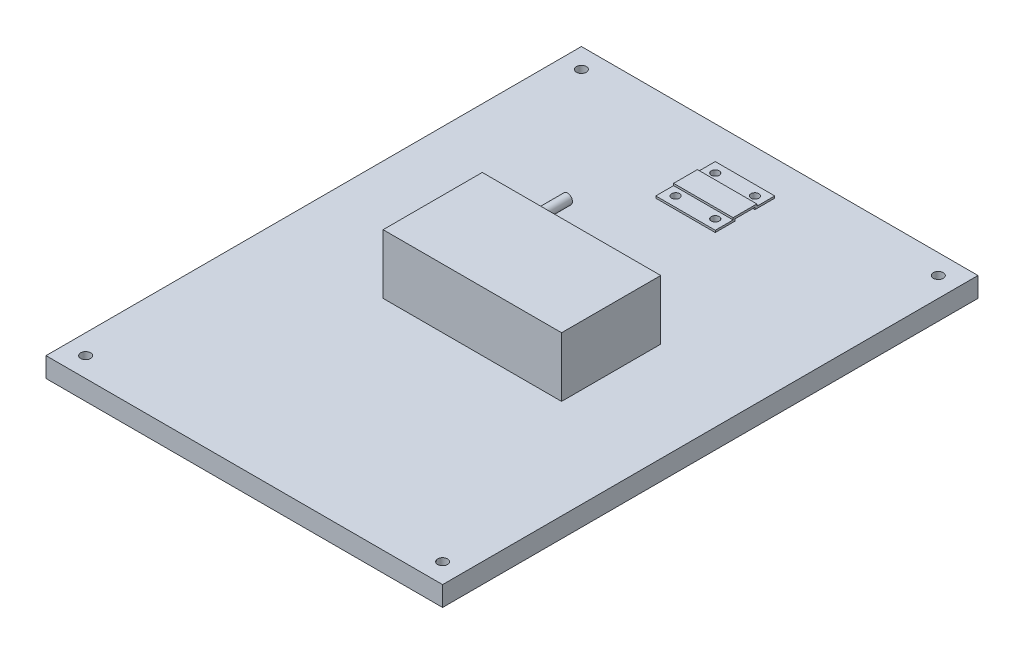
ISO-10303-21;
HEADER;
FILE_DESCRIPTION(('STEP AP214'),'2;1');
FILE_NAME('part.step','',(''),(''),'','','');
FILE_SCHEMA(('AUTOMOTIVE_DESIGN { 1 0 10303 214 1 1 1 1 }'));
ENDSEC;
DATA;
#1=APPLICATION_CONTEXT('core data for automotive mechanical design processes');
#2=APPLICATION_PROTOCOL_DEFINITION('international standard','automotive_design',2000,#1);
#3=PRODUCT_CONTEXT('',#1,'mechanical');
#4=PRODUCT('Part','Part','',(#3));
#5=PRODUCT_RELATED_PRODUCT_CATEGORY('part','',(#4));
#6=PRODUCT_DEFINITION_FORMATION('','',#4);
#7=PRODUCT_DEFINITION_CONTEXT('part definition',#1,'design');
#8=PRODUCT_DEFINITION('design','',#6,#7);
#9=PRODUCT_DEFINITION_SHAPE('','',#8);
#10=(LENGTH_UNIT() NAMED_UNIT(*) SI_UNIT(.MILLI.,.METRE.));
#11=(NAMED_UNIT(*) PLANE_ANGLE_UNIT() SI_UNIT($,.RADIAN.));
#12=(NAMED_UNIT(*) SI_UNIT($,.STERADIAN.) SOLID_ANGLE_UNIT());
#13=UNCERTAINTY_MEASURE_WITH_UNIT(LENGTH_MEASURE(1.E-05),#10,'distance_accuracy_value','');
#14=(GEOMETRIC_REPRESENTATION_CONTEXT(3) GLOBAL_UNCERTAINTY_ASSIGNED_CONTEXT((#13)) GLOBAL_UNIT_ASSIGNED_CONTEXT((#10,
#11,#12)) REPRESENTATION_CONTEXT('',''));
#15=CARTESIAN_POINT('',(0.,0.,0.));
#16=DIRECTION('',(0.,0.,1.));
#17=DIRECTION('',(1.,0.,0.));
#18=AXIS2_PLACEMENT_3D('',#15,#16,#17);
#19=CARTESIAN_POINT('',(0.,10.,0.));
#20=DIRECTION('',(0.,1.,0.));
#21=DIRECTION('',(0.,0.,1.));
#22=AXIS2_PLACEMENT_3D('',#19,#20,#21);
#23=PLANE('',#22);
#24=DIRECTION('',(0.,0.,-1.));
#25=VECTOR('',#24,1.);
#26=CARTESIAN_POINT('',(75.,10.,-185.));
#27=LINE('',#26,#25);
#28=CARTESIAN_POINT('',(75.,10.,-160.));
#29=VERTEX_POINT('',#28);
#30=CARTESIAN_POINT('',(75.,10.,-185.));
#31=VERTEX_POINT('',#30);
#32=EDGE_CURVE('E303',#29,#31,#27,.T.);
#33=ORIENTED_EDGE('',*,*,#32,.F.);
#34=DIRECTION('',(-1.,0.,0.));
#35=VECTOR('',#34,1.);
#36=CARTESIAN_POINT('',(150.,10.,-160.));
#37=LINE('',#36,#35);
#38=CARTESIAN_POINT('',(150.,10.,-160.));
#39=VERTEX_POINT('',#38);
#40=EDGE_CURVE('E341',#39,#29,#37,.T.);
#41=ORIENTED_EDGE('',*,*,#40,.F.);
#42=DIRECTION('',(0.,0.,-1.));
#43=VECTOR('',#42,1.);
#44=CARTESIAN_POINT('',(150.,10.,-110.));
#45=LINE('',#44,#43);
#46=CARTESIAN_POINT('',(150.,10.,-110.));
#47=VERTEX_POINT('',#46);
#48=EDGE_CURVE('E339',#47,#39,#45,.T.);
#49=ORIENTED_EDGE('',*,*,#48,.F.);
#50=DIRECTION('',(1.,0.,0.));
#51=VECTOR('',#50,1.);
#52=CARTESIAN_POINT('',(60.,10.,-110.));
#53=LINE('',#52,#51);
#54=CARTESIAN_POINT('',(60.,10.,-110.));
#55=VERTEX_POINT('',#54);
#56=EDGE_CURVE('E325',#55,#47,#53,.T.);
#57=ORIENTED_EDGE('',*,*,#56,.F.);
#58=DIRECTION('',(0.,0.,1.));
#59=VECTOR('',#58,1.);
#60=CARTESIAN_POINT('',(60.,10.,-160.));
#61=LINE('',#60,#59);
#62=CARTESIAN_POINT('',(60.,10.,-160.));
#63=VERTEX_POINT('',#62);
#64=EDGE_CURVE('E330',#63,#55,#61,.T.);
#65=ORIENTED_EDGE('',*,*,#64,.F.);
#66=DIRECTION('',(1.,0.,0.));
#67=VECTOR('',#66,1.);
#68=CARTESIAN_POINT('',(75.,10.,-160.));
#69=LINE('',#68,#67);
#70=CARTESIAN_POINT('',(58.,10.,-160.));
#71=VERTEX_POINT('',#70);
#72=EDGE_CURVE('E312',#71,#63,#69,.T.);
#73=ORIENTED_EDGE('',*,*,#72,.F.);
#74=DIRECTION('',(0.,0.,1.));
#75=VECTOR('',#74,1.);
#76=CARTESIAN_POINT('',(58.,10.,-160.));
#77=LINE('',#76,#75);
#78=CARTESIAN_POINT('',(58.,10.,-185.));
#79=VERTEX_POINT('',#78);
#80=EDGE_CURVE('E309',#79,#71,#77,.T.);
#81=ORIENTED_EDGE('',*,*,#80,.F.);
#82=DIRECTION('',(-1.,0.,0.));
#83=VECTOR('',#82,1.);
#84=CARTESIAN_POINT('',(58.,10.,-185.));
#85=LINE('',#84,#83);
#86=EDGE_CURVE('E306',#31,#79,#85,.T.);
#87=ORIENTED_EDGE('',*,*,#86,.F.);
#88=EDGE_LOOP('',(#33,#41,#49,#57,#65,#73,#81,#87));
#89=FACE_BOUND('',#88,.T.);
#90=CARTESIAN_POINT('',(9.99999999999998,10.,-260.));
#91=DIRECTION('',(0.,1.,0.));
#92=DIRECTION('',(0.,0.,1.));
#93=AXIS2_PLACEMENT_3D('',#90,#91,#92);
#94=CIRCLE('',#93,2.49999999999999);
#95=CARTESIAN_POINT('',(9.99999999999998,10.,-257.5));
#96=VERTEX_POINT('',#95);
#97=EDGE_CURVE('E359',#96,#96,#94,.T.);
#98=ORIENTED_EDGE('',*,*,#97,.F.);
#99=EDGE_LOOP('',(#98));
#100=FACE_BOUND('',#99,.T.);
#101=CARTESIAN_POINT('',(190.,10.,-10.));
#102=DIRECTION('',(0.,1.,0.));
#103=DIRECTION('',(0.,0.,1.));
#104=AXIS2_PLACEMENT_3D('',#101,#102,#103);
#105=CIRCLE('',#104,2.50000000000002);
#106=CARTESIAN_POINT('',(190.,10.,-7.49999999999998));
#107=VERTEX_POINT('',#106);
#108=EDGE_CURVE('E358',#107,#107,#105,.T.);
#109=ORIENTED_EDGE('',*,*,#108,.F.);
#110=EDGE_LOOP('',(#109));
#111=FACE_BOUND('',#110,.T.);
#112=CARTESIAN_POINT('',(190.,10.,-260.));
#113=DIRECTION('',(0.,1.,0.));
#114=DIRECTION('',(0.,0.,1.));
#115=AXIS2_PLACEMENT_3D('',#112,#113,#114);
#116=CIRCLE('',#115,2.50000000000002);
#117=CARTESIAN_POINT('',(190.,10.,-257.5));
#118=VERTEX_POINT('',#117);
#119=EDGE_CURVE('E355',#118,#118,#116,.T.);
#120=ORIENTED_EDGE('',*,*,#119,.F.);
#121=EDGE_LOOP('',(#120));
#122=FACE_BOUND('',#121,.T.);
#123=CARTESIAN_POINT('',(9.99999999999998,10.,-10.));
#124=DIRECTION('',(0.,1.,0.));
#125=DIRECTION('',(0.,0.,1.));
#126=AXIS2_PLACEMENT_3D('',#123,#124,#125);
#127=CIRCLE('',#126,2.49999999999999);
#128=CARTESIAN_POINT('',(9.99999999999998,10.,-7.50000000000001));
#129=VERTEX_POINT('',#128);
#130=EDGE_CURVE('E362',#129,#129,#127,.T.);
#131=ORIENTED_EDGE('',*,*,#130,.F.);
#132=EDGE_LOOP('',(#131));
#133=FACE_BOUND('',#132,.T.);
#134=DIRECTION('',(0.,0.,1.));
#135=VECTOR('',#134,1.);
#136=CARTESIAN_POINT('',(0.,10.,-270.));
#137=LINE('',#136,#135);
#138=CARTESIAN_POINT('',(0.,10.,-270.));
#139=VERTEX_POINT('',#138);
#140=CARTESIAN_POINT('',(0.,10.,0.));
#141=VERTEX_POINT('',#140);
#142=EDGE_CURVE('E368',#139,#141,#137,.T.);
#143=ORIENTED_EDGE('',*,*,#142,.T.);
#144=DIRECTION('',(1.,0.,0.));
#145=VECTOR('',#144,1.);
#146=CARTESIAN_POINT('',(0.,10.,0.));
#147=LINE('',#146,#145);
#148=CARTESIAN_POINT('',(200.,10.,0.));
#149=VERTEX_POINT('',#148);
#150=EDGE_CURVE('E371',#141,#149,#147,.T.);
#151=ORIENTED_EDGE('',*,*,#150,.T.);
#152=DIRECTION('',(0.,0.,-1.));
#153=VECTOR('',#152,1.);
#154=CARTESIAN_POINT('',(200.,10.,0.));
#155=LINE('',#154,#153);
#156=CARTESIAN_POINT('',(200.,10.,-270.));
#157=VERTEX_POINT('',#156);
#158=EDGE_CURVE('E374',#149,#157,#155,.T.);
#159=ORIENTED_EDGE('',*,*,#158,.T.);
#160=DIRECTION('',(-1.,0.,0.));
#161=VECTOR('',#160,1.);
#162=CARTESIAN_POINT('',(200.,10.,-270.));
#163=LINE('',#162,#161);
#164=EDGE_CURVE('E376',#157,#139,#163,.T.);
#165=ORIENTED_EDGE('',*,*,#164,.T.);
#166=EDGE_LOOP('',(#143,#151,#159,#165));
#167=FACE_BOUND('',#166,.T.);
#168=DIRECTION('',(-1.,0.,0.));
#169=VECTOR('',#168,1.);
#170=CARTESIAN_POINT('',(115.,10.,-232.5));
#171=LINE('',#170,#169);
#172=CARTESIAN_POINT('',(115.,10.,-232.5));
#173=VERTEX_POINT('',#172);
#174=CARTESIAN_POINT('',(85.,10.,-232.5));
#175=VERTEX_POINT('',#174);
#176=EDGE_CURVE('E218',#173,#175,#171,.T.);
#177=ORIENTED_EDGE('',*,*,#176,.F.);
#178=DIRECTION('',(0.,0.,-1.));
#179=VECTOR('',#178,1.);
#180=CARTESIAN_POINT('',(115.,10.,-232.5));
#181=LINE('',#180,#179);
#182=CARTESIAN_POINT('',(115.,10.,-222.5));
#183=VERTEX_POINT('',#182);
#184=EDGE_CURVE('E207',#183,#173,#181,.T.);
#185=ORIENTED_EDGE('',*,*,#184,.F.);
#186=DIRECTION('',(-1.,0.,0.));
#187=VECTOR('',#186,1.);
#188=CARTESIAN_POINT('',(115.,10.,-222.5));
#189=LINE('',#188,#187);
#190=CARTESIAN_POINT('',(85.,10.,-222.5));
#191=VERTEX_POINT('',#190);
#192=EDGE_CURVE('E244',#183,#191,#189,.T.);
#193=ORIENTED_EDGE('',*,*,#192,.T.);
#194=DIRECTION('',(0.,0.,-1.));
#195=VECTOR('',#194,1.);
#196=CARTESIAN_POINT('',(85.,10.,-232.5));
#197=LINE('',#196,#195);
#198=EDGE_CURVE('E245',#191,#175,#197,.T.);
#199=ORIENTED_EDGE('',*,*,#198,.T.);
#200=EDGE_LOOP('',(#177,#185,#193,#199));
#201=FACE_BOUND('',#200,.T.);
#202=DIRECTION('',(-1.,0.,0.));
#203=VECTOR('',#202,1.);
#204=CARTESIAN_POINT('',(115.,10.,-252.5));
#205=LINE('',#204,#203);
#206=CARTESIAN_POINT('',(115.,10.,-252.5));
#207=VERTEX_POINT('',#206);
#208=CARTESIAN_POINT('',(85.,10.,-252.5));
#209=VERTEX_POINT('',#208);
#210=EDGE_CURVE('E61',#207,#209,#205,.T.);
#211=ORIENTED_EDGE('',*,*,#210,.F.);
#212=DIRECTION('',(0.,0.,-1.));
#213=VECTOR('',#212,1.);
#214=CARTESIAN_POINT('',(115.,10.,-252.5));
#215=LINE('',#214,#213);
#216=CARTESIAN_POINT('',(115.,10.,-242.5));
#217=VERTEX_POINT('',#216);
#218=EDGE_CURVE('E56',#217,#207,#215,.T.);
#219=ORIENTED_EDGE('',*,*,#218,.F.);
#220=DIRECTION('',(-1.,0.,0.));
#221=VECTOR('',#220,1.);
#222=CARTESIAN_POINT('',(115.,10.,-242.5));
#223=LINE('',#222,#221);
#224=CARTESIAN_POINT('',(85.,10.,-242.5));
#225=VERTEX_POINT('',#224);
#226=EDGE_CURVE('E291',#217,#225,#223,.T.);
#227=ORIENTED_EDGE('',*,*,#226,.T.);
#228=DIRECTION('',(0.,0.,-1.));
#229=VECTOR('',#228,1.);
#230=CARTESIAN_POINT('',(85.,10.,-252.5));
#231=LINE('',#230,#229);
#232=EDGE_CURVE('E254',#225,#209,#231,.T.);
#233=ORIENTED_EDGE('',*,*,#232,.T.);
#234=EDGE_LOOP('',(#211,#219,#227,#233));
#235=FACE_BOUND('',#234,.T.);
#236=ADVANCED_FACE('F41',(#89,#100,#111,#122,#133,#167,#201,#235),#23,.T.);
#237=CARTESIAN_POINT('',(0.,10.,-270.));
#238=DIRECTION('',(1.,0.,0.));
#239=DIRECTION('',(0.,0.,-1.));
#240=AXIS2_PLACEMENT_3D('',#237,#238,#239);
#241=PLANE('',#240);
#242=DIRECTION('',(0.,0.,1.));
#243=VECTOR('',#242,1.);
#244=CARTESIAN_POINT('',(0.,0.,-270.));
#245=LINE('',#244,#243);
#246=CARTESIAN_POINT('',(0.,0.,-270.));
#247=VERTEX_POINT('',#246);
#248=CARTESIAN_POINT('',(0.,0.,0.));
#249=VERTEX_POINT('',#248);
#250=EDGE_CURVE('E379',#247,#249,#245,.T.);
#251=ORIENTED_EDGE('',*,*,#250,.T.);
#252=DIRECTION('',(0.,-1.,0.));
#253=VECTOR('',#252,1.);
#254=CARTESIAN_POINT('',(0.,10.,0.));
#255=LINE('',#254,#253);
#256=EDGE_CURVE('E49',#141,#249,#255,.T.);
#257=ORIENTED_EDGE('',*,*,#256,.F.);
#258=ORIENTED_EDGE('',*,*,#142,.F.);
#259=DIRECTION('',(0.,-1.,0.));
#260=VECTOR('',#259,1.);
#261=CARTESIAN_POINT('',(0.,10.,-270.));
#262=LINE('',#261,#260);
#263=EDGE_CURVE('E378',#139,#247,#262,.T.);
#264=ORIENTED_EDGE('',*,*,#263,.T.);
#265=EDGE_LOOP('',(#251,#257,#258,#264));
#266=FACE_BOUND('',#265,.T.);
#267=ADVANCED_FACE('F43',(#266),#241,.F.);
#268=CARTESIAN_POINT('',(0.,10.,0.));
#269=DIRECTION('',(0.,0.,-1.));
#270=DIRECTION('',(-1.,0.,0.));
#271=AXIS2_PLACEMENT_3D('',#268,#269,#270);
#272=PLANE('',#271);
#273=DIRECTION('',(1.,0.,0.));
#274=VECTOR('',#273,1.);
#275=CARTESIAN_POINT('',(0.,0.,0.));
#276=LINE('',#275,#274);
#277=CARTESIAN_POINT('',(200.,0.,0.));
#278=VERTEX_POINT('',#277);
#279=EDGE_CURVE('E382',#249,#278,#276,.T.);
#280=ORIENTED_EDGE('',*,*,#279,.T.);
#281=DIRECTION('',(0.,-1.,0.));
#282=VECTOR('',#281,1.);
#283=CARTESIAN_POINT('',(200.,10.,0.));
#284=LINE('',#283,#282);
#285=EDGE_CURVE('E393',#149,#278,#284,.T.);
#286=ORIENTED_EDGE('',*,*,#285,.F.);
#287=ORIENTED_EDGE('',*,*,#150,.F.);
#288=ORIENTED_EDGE('',*,*,#256,.T.);
#289=EDGE_LOOP('',(#280,#286,#287,#288));
#290=FACE_BOUND('',#289,.T.);
#291=ADVANCED_FACE('F434',(#290),#272,.F.);
#292=CARTESIAN_POINT('',(200.,10.,0.));
#293=DIRECTION('',(-1.,0.,0.));
#294=DIRECTION('',(0.,0.,1.));
#295=AXIS2_PLACEMENT_3D('',#292,#293,#294);
#296=PLANE('',#295);
#297=DIRECTION('',(0.,0.,-1.));
#298=VECTOR('',#297,1.);
#299=CARTESIAN_POINT('',(200.,0.,0.));
#300=LINE('',#299,#298);
#301=CARTESIAN_POINT('',(200.,0.,-270.));
#302=VERTEX_POINT('',#301);
#303=EDGE_CURVE('E385',#278,#302,#300,.T.);
#304=ORIENTED_EDGE('',*,*,#303,.T.);
#305=DIRECTION('',(0.,-1.,0.));
#306=VECTOR('',#305,1.);
#307=CARTESIAN_POINT('',(200.,10.,-270.));
#308=LINE('',#307,#306);
#309=EDGE_CURVE('E390',#157,#302,#308,.T.);
#310=ORIENTED_EDGE('',*,*,#309,.F.);
#311=ORIENTED_EDGE('',*,*,#158,.F.);
#312=ORIENTED_EDGE('',*,*,#285,.T.);
#313=EDGE_LOOP('',(#304,#310,#311,#312));
#314=FACE_BOUND('',#313,.T.);
#315=ADVANCED_FACE('F447',(#314),#296,.F.);
#316=CARTESIAN_POINT('',(200.,10.,-270.));
#317=DIRECTION('',(0.,0.,1.));
#318=DIRECTION('',(1.,0.,0.));
#319=AXIS2_PLACEMENT_3D('',#316,#317,#318);
#320=PLANE('',#319);
#321=DIRECTION('',(-1.,0.,0.));
#322=VECTOR('',#321,1.);
#323=CARTESIAN_POINT('',(200.,0.,-270.));
#324=LINE('',#323,#322);
#325=EDGE_CURVE('E372',#302,#247,#324,.T.);
#326=ORIENTED_EDGE('',*,*,#325,.T.);
#327=ORIENTED_EDGE('',*,*,#263,.F.);
#328=ORIENTED_EDGE('',*,*,#164,.F.);
#329=ORIENTED_EDGE('',*,*,#309,.T.);
#330=EDGE_LOOP('',(#326,#327,#328,#329));
#331=FACE_BOUND('',#330,.T.);
#332=ADVANCED_FACE('F443',(#331),#320,.F.);
#333=CARTESIAN_POINT('',(0.,0.,0.));
#334=DIRECTION('',(0.,1.,0.));
#335=DIRECTION('',(0.,0.,1.));
#336=AXIS2_PLACEMENT_3D('',#333,#334,#335);
#337=PLANE('',#336);
#338=DIRECTION('',(-1.,0.,0.));
#339=VECTOR('',#338,1.);
#340=CARTESIAN_POINT('',(75.,0.,-160.));
#341=LINE('',#340,#339);
#342=CARTESIAN_POINT('',(75.,0.,-160.));
#343=VERTEX_POINT('',#342);
#344=CARTESIAN_POINT('',(58.,0.,-160.));
#345=VERTEX_POINT('',#344);
#346=EDGE_CURVE('E297',#343,#345,#341,.T.);
#347=ORIENTED_EDGE('',*,*,#346,.F.);
#348=DIRECTION('',(0.,0.,1.));
#349=VECTOR('',#348,1.);
#350=CARTESIAN_POINT('',(75.,0.,-185.));
#351=LINE('',#350,#349);
#352=CARTESIAN_POINT('',(75.,0.,-185.));
#353=VERTEX_POINT('',#352);
#354=EDGE_CURVE('E300',#353,#343,#351,.T.);
#355=ORIENTED_EDGE('',*,*,#354,.F.);
#356=DIRECTION('',(1.,0.,0.));
#357=VECTOR('',#356,1.);
#358=CARTESIAN_POINT('',(58.,0.,-185.));
#359=LINE('',#358,#357);
#360=CARTESIAN_POINT('',(58.,0.,-185.));
#361=VERTEX_POINT('',#360);
#362=EDGE_CURVE('E317',#361,#353,#359,.T.);
#363=ORIENTED_EDGE('',*,*,#362,.F.);
#364=DIRECTION('',(0.,0.,-1.));
#365=VECTOR('',#364,1.);
#366=CARTESIAN_POINT('',(58.,0.,-160.));
#367=LINE('',#366,#365);
#368=EDGE_CURVE('E295',#345,#361,#367,.T.);
#369=ORIENTED_EDGE('',*,*,#368,.F.);
#370=EDGE_LOOP('',(#347,#355,#363,#369));
#371=FACE_BOUND('',#370,.T.);
#372=CARTESIAN_POINT('',(9.99999999999998,0.,-260.));
#373=DIRECTION('',(0.,1.,0.));
#374=DIRECTION('',(0.,0.,1.));
#375=AXIS2_PLACEMENT_3D('',#372,#373,#374);
#376=CIRCLE('',#375,2.49999999999999);
#377=CARTESIAN_POINT('',(9.99999999999998,0.,-257.5));
#378=VERTEX_POINT('',#377);
#379=EDGE_CURVE('E383',#378,#378,#376,.T.);
#380=ORIENTED_EDGE('',*,*,#379,.T.);
#381=EDGE_LOOP('',(#380));
#382=FACE_BOUND('',#381,.T.);
#383=CARTESIAN_POINT('',(190.,0.,-10.));
#384=DIRECTION('',(0.,1.,0.));
#385=DIRECTION('',(0.,0.,1.));
#386=AXIS2_PLACEMENT_3D('',#383,#384,#385);
#387=CIRCLE('',#386,2.50000000000002);
#388=CARTESIAN_POINT('',(190.,0.,-7.49999999999998));
#389=VERTEX_POINT('',#388);
#390=EDGE_CURVE('E403',#389,#389,#387,.T.);
#391=ORIENTED_EDGE('',*,*,#390,.T.);
#392=EDGE_LOOP('',(#391));
#393=FACE_BOUND('',#392,.T.);
#394=CARTESIAN_POINT('',(190.,0.,-260.));
#395=DIRECTION('',(0.,1.,0.));
#396=DIRECTION('',(0.,0.,1.));
#397=AXIS2_PLACEMENT_3D('',#394,#395,#396);
#398=CIRCLE('',#397,2.50000000000002);
#399=CARTESIAN_POINT('',(190.,0.,-257.5));
#400=VERTEX_POINT('',#399);
#401=EDGE_CURVE('E400',#400,#400,#398,.T.);
#402=ORIENTED_EDGE('',*,*,#401,.T.);
#403=EDGE_LOOP('',(#402));
#404=FACE_BOUND('',#403,.T.);
#405=CARTESIAN_POINT('',(9.99999999999998,0.,-10.));
#406=DIRECTION('',(0.,1.,0.));
#407=DIRECTION('',(0.,0.,1.));
#408=AXIS2_PLACEMENT_3D('',#405,#406,#407);
#409=CIRCLE('',#408,2.49999999999999);
#410=CARTESIAN_POINT('',(9.99999999999998,0.,-7.50000000000001));
#411=VERTEX_POINT('',#410);
#412=EDGE_CURVE('E367',#411,#411,#409,.T.);
#413=ORIENTED_EDGE('',*,*,#412,.T.);
#414=EDGE_LOOP('',(#413));
#415=FACE_BOUND('',#414,.T.);
#416=ORIENTED_EDGE('',*,*,#250,.F.);
#417=ORIENTED_EDGE('',*,*,#325,.F.);
#418=ORIENTED_EDGE('',*,*,#303,.F.);
#419=ORIENTED_EDGE('',*,*,#279,.F.);
#420=EDGE_LOOP('',(#416,#417,#418,#419));
#421=FACE_BOUND('',#420,.T.);
#422=ADVANCED_FACE('F408',(#371,#382,#393,#404,#415,#421),#337,.F.);
#423=CARTESIAN_POINT('',(9.99999999999998,-10.,-10.));
#424=DIRECTION('',(0.,1.,0.));
#425=DIRECTION('',(0.,0.,1.));
#426=AXIS2_PLACEMENT_3D('',#423,#424,#425);
#427=CYLINDRICAL_SURFACE('',#426,2.49999999999999);
#428=ORIENTED_EDGE('',*,*,#130,.T.);
#429=EDGE_LOOP('',(#428));
#430=FACE_BOUND('',#429,.T.);
#431=ORIENTED_EDGE('',*,*,#412,.F.);
#432=EDGE_LOOP('',(#431));
#433=FACE_BOUND('',#432,.T.);
#434=ADVANCED_FACE('F440',(#430,#433),#427,.F.);
#435=CARTESIAN_POINT('',(190.,-10.,-260.));
#436=DIRECTION('',(0.,1.,0.));
#437=DIRECTION('',(0.,0.,1.));
#438=AXIS2_PLACEMENT_3D('',#435,#436,#437);
#439=CYLINDRICAL_SURFACE('',#438,2.50000000000002);
#440=ORIENTED_EDGE('',*,*,#119,.T.);
#441=EDGE_LOOP('',(#440));
#442=FACE_BOUND('',#441,.T.);
#443=ORIENTED_EDGE('',*,*,#401,.F.);
#444=EDGE_LOOP('',(#443));
#445=FACE_BOUND('',#444,.T.);
#446=ADVANCED_FACE('F424',(#442,#445),#439,.F.);
#447=CARTESIAN_POINT('',(190.,-10.,-10.));
#448=DIRECTION('',(0.,1.,0.));
#449=DIRECTION('',(0.,0.,1.));
#450=AXIS2_PLACEMENT_3D('',#447,#448,#449);
#451=CYLINDRICAL_SURFACE('',#450,2.50000000000002);
#452=ORIENTED_EDGE('',*,*,#108,.T.);
#453=EDGE_LOOP('',(#452));
#454=FACE_BOUND('',#453,.T.);
#455=ORIENTED_EDGE('',*,*,#390,.F.);
#456=EDGE_LOOP('',(#455));
#457=FACE_BOUND('',#456,.T.);
#458=ADVANCED_FACE('F414',(#454,#457),#451,.F.);
#459=CARTESIAN_POINT('',(9.99999999999998,-10.,-260.));
#460=DIRECTION('',(0.,1.,0.));
#461=DIRECTION('',(0.,0.,1.));
#462=AXIS2_PLACEMENT_3D('',#459,#460,#461);
#463=CYLINDRICAL_SURFACE('',#462,2.49999999999999);
#464=ORIENTED_EDGE('',*,*,#97,.T.);
#465=EDGE_LOOP('',(#464));
#466=FACE_BOUND('',#465,.T.);
#467=ORIENTED_EDGE('',*,*,#379,.F.);
#468=EDGE_LOOP('',(#467));
#469=FACE_BOUND('',#468,.T.);
#470=ADVANCED_FACE('F411',(#466,#469),#463,.F.);
#471=CARTESIAN_POINT('',(60.,40.,-110.));
#472=DIRECTION('',(0.,0.,-1.));
#473=DIRECTION('',(-1.,0.,0.));
#474=AXIS2_PLACEMENT_3D('',#471,#472,#473);
#475=PLANE('',#474);
#476=ORIENTED_EDGE('',*,*,#56,.T.);
#477=DIRECTION('',(0.,-1.,0.));
#478=VECTOR('',#477,1.);
#479=CARTESIAN_POINT('',(150.,40.,-110.));
#480=LINE('',#479,#478);
#481=CARTESIAN_POINT('',(150.,40.,-110.));
#482=VERTEX_POINT('',#481);
#483=EDGE_CURVE('E353',#482,#47,#480,.T.);
#484=ORIENTED_EDGE('',*,*,#483,.F.);
#485=DIRECTION('',(1.,0.,0.));
#486=VECTOR('',#485,1.);
#487=CARTESIAN_POINT('',(60.,40.,-110.));
#488=LINE('',#487,#486);
#489=CARTESIAN_POINT('',(60.,40.,-110.));
#490=VERTEX_POINT('',#489);
#491=EDGE_CURVE('E326',#490,#482,#488,.T.);
#492=ORIENTED_EDGE('',*,*,#491,.F.);
#493=DIRECTION('',(0.,-1.,0.));
#494=VECTOR('',#493,1.);
#495=CARTESIAN_POINT('',(60.,40.,-110.));
#496=LINE('',#495,#494);
#497=EDGE_CURVE('E336',#490,#55,#496,.T.);
#498=ORIENTED_EDGE('',*,*,#497,.T.);
#499=EDGE_LOOP('',(#476,#484,#492,#498));
#500=FACE_BOUND('',#499,.T.);
#501=ADVANCED_FACE('F413',(#500),#475,.F.);
#502=CARTESIAN_POINT('',(150.,40.,-110.));
#503=DIRECTION('',(-1.,0.,0.));
#504=DIRECTION('',(0.,0.,1.));
#505=AXIS2_PLACEMENT_3D('',#502,#503,#504);
#506=PLANE('',#505);
#507=ORIENTED_EDGE('',*,*,#48,.T.);
#508=DIRECTION('',(0.,-1.,0.));
#509=VECTOR('',#508,1.);
#510=CARTESIAN_POINT('',(150.,40.,-160.));
#511=LINE('',#510,#509);
#512=CARTESIAN_POINT('',(150.,40.,-160.));
#513=VERTEX_POINT('',#512);
#514=EDGE_CURVE('E350',#513,#39,#511,.T.);
#515=ORIENTED_EDGE('',*,*,#514,.F.);
#516=DIRECTION('',(0.,0.,-1.));
#517=VECTOR('',#516,1.);
#518=CARTESIAN_POINT('',(150.,40.,-110.));
#519=LINE('',#518,#517);
#520=EDGE_CURVE('E329',#482,#513,#519,.T.);
#521=ORIENTED_EDGE('',*,*,#520,.F.);
#522=ORIENTED_EDGE('',*,*,#483,.T.);
#523=EDGE_LOOP('',(#507,#515,#521,#522));
#524=FACE_BOUND('',#523,.T.);
#525=ADVANCED_FACE('F421',(#524),#506,.F.);
#526=CARTESIAN_POINT('',(150.,40.,-160.));
#527=DIRECTION('',(0.,0.,1.));
#528=DIRECTION('',(1.,0.,0.));
#529=AXIS2_PLACEMENT_3D('',#526,#527,#528);
#530=PLANE('',#529);
#531=CARTESIAN_POINT('',(78.,25.,-160.));
#532=DIRECTION('',(0.,0.,1.));
#533=DIRECTION('',(1.,0.,0.));
#534=AXIS2_PLACEMENT_3D('',#531,#532,#533);
#535=CIRCLE('',#534,2.50000000000001);
#536=CARTESIAN_POINT('',(80.5,25.,-160.));
#537=VERTEX_POINT('',#536);
#538=EDGE_CURVE('E11',#537,#537,#535,.F.);
#539=ORIENTED_EDGE('',*,*,#538,.F.);
#540=EDGE_LOOP('',(#539));
#541=FACE_BOUND('',#540,.T.);
#542=ORIENTED_EDGE('',*,*,#40,.T.);
#543=DIRECTION('',(0.,1.,0.));
#544=VECTOR('',#543,1.);
#545=CARTESIAN_POINT('',(75.,-0.000999999999999265,-160.));
#546=LINE('',#545,#544);
#547=EDGE_CURVE('E315',#343,#29,#546,.T.);
#548=ORIENTED_EDGE('',*,*,#547,.F.);
#549=ORIENTED_EDGE('',*,*,#346,.T.);
#550=DIRECTION('',(0.,1.,0.));
#551=VECTOR('',#550,1.);
#552=CARTESIAN_POINT('',(58.,-0.000999999999999265,-160.));
#553=LINE('',#552,#551);
#554=EDGE_CURVE('E318',#345,#71,#553,.T.);
#555=ORIENTED_EDGE('',*,*,#554,.T.);
#556=ORIENTED_EDGE('',*,*,#72,.T.);
#557=DIRECTION('',(0.,-1.,0.));
#558=VECTOR('',#557,1.);
#559=CARTESIAN_POINT('',(60.,40.,-160.));
#560=LINE('',#559,#558);
#561=CARTESIAN_POINT('',(60.,40.,-160.));
#562=VERTEX_POINT('',#561);
#563=EDGE_CURVE('E347',#562,#63,#560,.T.);
#564=ORIENTED_EDGE('',*,*,#563,.F.);
#565=DIRECTION('',(-1.,0.,0.));
#566=VECTOR('',#565,1.);
#567=CARTESIAN_POINT('',(150.,40.,-160.));
#568=LINE('',#567,#566);
#569=EDGE_CURVE('E332',#513,#562,#568,.T.);
#570=ORIENTED_EDGE('',*,*,#569,.F.);
#571=ORIENTED_EDGE('',*,*,#514,.T.);
#572=EDGE_LOOP('',(#542,#548,#549,#555,#556,#564,#570,#571));
#573=FACE_BOUND('',#572,.T.);
#574=ADVANCED_FACE('F558',(#541,#573),#530,.F.);
#575=CARTESIAN_POINT('',(60.,40.,-160.));
#576=DIRECTION('',(1.,0.,0.));
#577=DIRECTION('',(0.,0.,-1.));
#578=AXIS2_PLACEMENT_3D('',#575,#576,#577);
#579=PLANE('',#578);
#580=ORIENTED_EDGE('',*,*,#64,.T.);
#581=ORIENTED_EDGE('',*,*,#497,.F.);
#582=DIRECTION('',(0.,0.,1.));
#583=VECTOR('',#582,1.);
#584=CARTESIAN_POINT('',(60.,40.,-160.));
#585=LINE('',#584,#583);
#586=EDGE_CURVE('E334',#562,#490,#585,.T.);
#587=ORIENTED_EDGE('',*,*,#586,.F.);
#588=ORIENTED_EDGE('',*,*,#563,.T.);
#589=EDGE_LOOP('',(#580,#581,#587,#588));
#590=FACE_BOUND('',#589,.T.);
#591=ADVANCED_FACE('F554',(#590),#579,.F.);
#592=CARTESIAN_POINT('',(0.,40.,0.));
#593=DIRECTION('',(0.,1.,0.));
#594=DIRECTION('',(0.,0.,1.));
#595=AXIS2_PLACEMENT_3D('',#592,#593,#594);
#596=PLANE('',#595);
#597=ORIENTED_EDGE('',*,*,#491,.T.);
#598=ORIENTED_EDGE('',*,*,#520,.T.);
#599=ORIENTED_EDGE('',*,*,#569,.T.);
#600=ORIENTED_EDGE('',*,*,#586,.T.);
#601=EDGE_LOOP('',(#597,#598,#599,#600));
#602=FACE_BOUND('',#601,.T.);
#603=ADVANCED_FACE('F550',(#602),#596,.T.);
#604=CARTESIAN_POINT('',(75.,-0.000999999999999265,-185.));
#605=DIRECTION('',(1.,0.,0.));
#606=DIRECTION('',(0.,0.,-1.));
#607=AXIS2_PLACEMENT_3D('',#604,#605,#606);
#608=PLANE('',#607);
#609=ORIENTED_EDGE('',*,*,#354,.T.);
#610=ORIENTED_EDGE('',*,*,#547,.T.);
#611=ORIENTED_EDGE('',*,*,#32,.T.);
#612=DIRECTION('',(0.,1.,0.));
#613=VECTOR('',#612,1.);
#614=CARTESIAN_POINT('',(75.,-0.000999999999999265,-185.));
#615=LINE('',#614,#613);
#616=EDGE_CURVE('E314',#353,#31,#615,.T.);
#617=ORIENTED_EDGE('',*,*,#616,.F.);
#618=EDGE_LOOP('',(#609,#610,#611,#617));
#619=FACE_BOUND('',#618,.T.);
#620=ADVANCED_FACE('F543',(#619),#608,.F.);
#621=CARTESIAN_POINT('',(58.,-0.000999999999999265,-160.));
#622=DIRECTION('',(-1.,0.,0.));
#623=DIRECTION('',(0.,0.,1.));
#624=AXIS2_PLACEMENT_3D('',#621,#622,#623);
#625=PLANE('',#624);
#626=ORIENTED_EDGE('',*,*,#368,.T.);
#627=DIRECTION('',(0.,1.,0.));
#628=VECTOR('',#627,1.);
#629=CARTESIAN_POINT('',(58.,-0.000999999999999265,-185.));
#630=LINE('',#629,#628);
#631=EDGE_CURVE('E320',#361,#79,#630,.T.);
#632=ORIENTED_EDGE('',*,*,#631,.T.);
#633=ORIENTED_EDGE('',*,*,#80,.T.);
#634=ORIENTED_EDGE('',*,*,#554,.F.);
#635=EDGE_LOOP('',(#626,#632,#633,#634));
#636=FACE_BOUND('',#635,.T.);
#637=ADVANCED_FACE('F540',(#636),#625,.F.);
#638=CARTESIAN_POINT('',(58.,-0.000999999999999265,-185.));
#639=DIRECTION('',(0.,0.,-1.));
#640=DIRECTION('',(-1.,0.,0.));
#641=AXIS2_PLACEMENT_3D('',#638,#639,#640);
#642=PLANE('',#641);
#643=ORIENTED_EDGE('',*,*,#362,.T.);
#644=ORIENTED_EDGE('',*,*,#616,.T.);
#645=ORIENTED_EDGE('',*,*,#86,.T.);
#646=ORIENTED_EDGE('',*,*,#631,.F.);
#647=EDGE_LOOP('',(#643,#644,#645,#646));
#648=FACE_BOUND('',#647,.T.);
#649=ADVANCED_FACE('F539',(#648),#642,.F.);
#650=CARTESIAN_POINT('',(115.,10.,-232.5));
#651=DIRECTION('',(0.,0.,1.));
#652=DIRECTION('',(1.,0.,0.));
#653=AXIS2_PLACEMENT_3D('',#650,#651,#652);
#654=PLANE('',#653);
#655=DIRECTION('',(0.,1.,0.));
#656=VECTOR('',#655,1.);
#657=CARTESIAN_POINT('',(85.,10.,-232.5));
#658=LINE('',#657,#656);
#659=CARTESIAN_POINT('',(85.,11.,-232.5));
#660=VERTEX_POINT('',#659);
#661=EDGE_CURVE('E215',#175,#660,#658,.T.);
#662=ORIENTED_EDGE('',*,*,#661,.T.);
#663=DIRECTION('',(-1.,0.,0.));
#664=VECTOR('',#663,1.);
#665=CARTESIAN_POINT('',(115.,11.,-232.5));
#666=LINE('',#665,#664);
#667=CARTESIAN_POINT('',(115.,11.,-232.5));
#668=VERTEX_POINT('',#667);
#669=EDGE_CURVE('E212',#668,#660,#666,.T.);
#670=ORIENTED_EDGE('',*,*,#669,.F.);
#671=DIRECTION('',(0.,1.,0.));
#672=VECTOR('',#671,1.);
#673=CARTESIAN_POINT('',(115.,10.,-232.5));
#674=LINE('',#673,#672);
#675=EDGE_CURVE('E200',#173,#668,#674,.T.);
#676=ORIENTED_EDGE('',*,*,#675,.F.);
#677=ORIENTED_EDGE('',*,*,#176,.T.);
#678=EDGE_LOOP('',(#662,#670,#676,#677));
#679=FACE_BOUND('',#678,.T.);
#680=ADVANCED_FACE('F213',(#679),#654,.F.);
#681=CARTESIAN_POINT('',(115.,11.,-232.5));
#682=DIRECTION('',(0.,1.,0.));
#683=DIRECTION('',(0.,0.,1.));
#684=AXIS2_PLACEMENT_3D('',#681,#682,#683);
#685=PLANE('',#684);
#686=DIRECTION('',(0.,0.,-1.));
#687=VECTOR('',#686,1.);
#688=CARTESIAN_POINT('',(85.,11.,-232.5));
#689=LINE('',#688,#687);
#690=CARTESIAN_POINT('',(85.,11.,-242.5));
#691=VERTEX_POINT('',#690);
#692=EDGE_CURVE('E249',#660,#691,#689,.T.);
#693=ORIENTED_EDGE('',*,*,#692,.T.);
#694=DIRECTION('',(-1.,0.,0.));
#695=VECTOR('',#694,1.);
#696=CARTESIAN_POINT('',(115.,11.,-242.5));
#697=LINE('',#696,#695);
#698=CARTESIAN_POINT('',(115.,11.,-242.5));
#699=VERTEX_POINT('',#698);
#700=EDGE_CURVE('E219',#699,#691,#697,.T.);
#701=ORIENTED_EDGE('',*,*,#700,.F.);
#702=DIRECTION('',(0.,0.,-1.));
#703=VECTOR('',#702,1.);
#704=CARTESIAN_POINT('',(115.,11.,-232.5));
#705=LINE('',#704,#703);
#706=EDGE_CURVE('E204',#668,#699,#705,.T.);
#707=ORIENTED_EDGE('',*,*,#706,.F.);
#708=ORIENTED_EDGE('',*,*,#669,.T.);
#709=EDGE_LOOP('',(#693,#701,#707,#708));
#710=FACE_BOUND('',#709,.T.);
#711=ADVANCED_FACE('F221',(#710),#685,.F.);
#712=CARTESIAN_POINT('',(115.,11.,-242.5));
#713=DIRECTION('',(0.,0.,-1.));
#714=DIRECTION('',(-1.,0.,0.));
#715=AXIS2_PLACEMENT_3D('',#712,#713,#714);
#716=PLANE('',#715);
#717=DIRECTION('',(0.,-1.,0.));
#718=VECTOR('',#717,1.);
#719=CARTESIAN_POINT('',(85.,11.,-242.5));
#720=LINE('',#719,#718);
#721=EDGE_CURVE('E251',#691,#225,#720,.T.);
#722=ORIENTED_EDGE('',*,*,#721,.T.);
#723=ORIENTED_EDGE('',*,*,#226,.F.);
#724=DIRECTION('',(0.,-1.,0.));
#725=VECTOR('',#724,1.);
#726=CARTESIAN_POINT('',(115.,11.,-242.5));
#727=LINE('',#726,#725);
#728=EDGE_CURVE('E224',#699,#217,#727,.T.);
#729=ORIENTED_EDGE('',*,*,#728,.F.);
#730=ORIENTED_EDGE('',*,*,#700,.T.);
#731=EDGE_LOOP('',(#722,#723,#729,#730));
#732=FACE_BOUND('',#731,.T.);
#733=ADVANCED_FACE('F476',(#732),#716,.F.);
#734=CARTESIAN_POINT('',(115.,11.,-252.5));
#735=DIRECTION('',(0.,0.,1.));
#736=DIRECTION('',(1.,0.,0.));
#737=AXIS2_PLACEMENT_3D('',#734,#735,#736);
#738=PLANE('',#737);
#739=DIRECTION('',(0.,1.,0.));
#740=VECTOR('',#739,1.);
#741=CARTESIAN_POINT('',(85.,11.,-252.5));
#742=LINE('',#741,#740);
#743=CARTESIAN_POINT('',(85.,11.,-252.5));
#744=VERTEX_POINT('',#743);
#745=EDGE_CURVE('E256',#209,#744,#742,.T.);
#746=ORIENTED_EDGE('',*,*,#745,.T.);
#747=DIRECTION('',(-1.,0.,0.));
#748=VECTOR('',#747,1.);
#749=CARTESIAN_POINT('',(115.,11.,-252.5));
#750=LINE('',#749,#748);
#751=CARTESIAN_POINT('',(115.,11.,-252.5));
#752=VERTEX_POINT('',#751);
#753=EDGE_CURVE('E287',#752,#744,#750,.T.);
#754=ORIENTED_EDGE('',*,*,#753,.F.);
#755=DIRECTION('',(0.,1.,0.));
#756=VECTOR('',#755,1.);
#757=CARTESIAN_POINT('',(115.,11.,-252.5));
#758=LINE('',#757,#756);
#759=EDGE_CURVE('E230',#207,#752,#758,.T.);
#760=ORIENTED_EDGE('',*,*,#759,.F.);
#761=ORIENTED_EDGE('',*,*,#210,.T.);
#762=EDGE_LOOP('',(#746,#754,#760,#761));
#763=FACE_BOUND('',#762,.T.);
#764=ADVANCED_FACE('F481',(#763),#738,.F.);
#765=CARTESIAN_POINT('',(115.,11.,-243.5));
#766=DIRECTION('',(0.,-1.,0.));
#767=DIRECTION('',(0.,0.,-1.));
#768=AXIS2_PLACEMENT_3D('',#765,#766,#767);
#769=PLANE('',#768);
#770=CARTESIAN_POINT('',(90.,11.,-247.5));
#771=DIRECTION('',(0.,1.,0.));
#772=DIRECTION('',(0.,0.,1.));
#773=AXIS2_PLACEMENT_3D('',#770,#771,#772);
#774=CIRCLE('',#773,2.);
#775=CARTESIAN_POINT('',(90.,11.,-245.5));
#776=VERTEX_POINT('',#775);
#777=EDGE_CURVE('E954',#776,#776,#774,.T.);
#778=ORIENTED_EDGE('',*,*,#777,.F.);
#779=EDGE_LOOP('',(#778));
#780=FACE_BOUND('',#779,.T.);
#781=CARTESIAN_POINT('',(110.,11.,-247.5));
#782=DIRECTION('',(0.,1.,0.));
#783=DIRECTION('',(0.,0.,1.));
#784=AXIS2_PLACEMENT_3D('',#781,#782,#783);
#785=CIRCLE('',#784,2.);
#786=CARTESIAN_POINT('',(110.,11.,-245.5));
#787=VERTEX_POINT('',#786);
#788=EDGE_CURVE('E941',#787,#787,#785,.T.);
#789=ORIENTED_EDGE('',*,*,#788,.F.);
#790=EDGE_LOOP('',(#789));
#791=FACE_BOUND('',#790,.T.);
#792=DIRECTION('',(0.,0.,1.));
#793=VECTOR('',#792,1.);
#794=CARTESIAN_POINT('',(85.,11.,-243.5));
#795=LINE('',#794,#793);
#796=CARTESIAN_POINT('',(85.,11.,-243.5));
#797=VERTEX_POINT('',#796);
#798=EDGE_CURVE('E258',#744,#797,#795,.T.);
#799=ORIENTED_EDGE('',*,*,#798,.T.);
#800=DIRECTION('',(-1.,0.,0.));
#801=VECTOR('',#800,1.);
#802=CARTESIAN_POINT('',(115.,11.,-243.5));
#803=LINE('',#802,#801);
#804=CARTESIAN_POINT('',(115.,11.,-243.5));
#805=VERTEX_POINT('',#804);
#806=EDGE_CURVE('E284',#805,#797,#803,.T.);
#807=ORIENTED_EDGE('',*,*,#806,.F.);
#808=DIRECTION('',(0.,0.,1.));
#809=VECTOR('',#808,1.);
#810=CARTESIAN_POINT('',(115.,11.,-243.5));
#811=LINE('',#810,#809);
#812=EDGE_CURVE('E232',#752,#805,#811,.T.);
#813=ORIENTED_EDGE('',*,*,#812,.F.);
#814=ORIENTED_EDGE('',*,*,#753,.T.);
#815=EDGE_LOOP('',(#799,#807,#813,#814));
#816=FACE_BOUND('',#815,.T.);
#817=ADVANCED_FACE('F487',(#780,#791,#816),#769,.F.);
#818=CARTESIAN_POINT('',(115.,12.,-243.5));
#819=DIRECTION('',(0.,0.,1.));
#820=DIRECTION('',(1.,0.,0.));
#821=AXIS2_PLACEMENT_3D('',#818,#819,#820);
#822=PLANE('',#821);
#823=DIRECTION('',(0.,1.,0.));
#824=VECTOR('',#823,1.);
#825=CARTESIAN_POINT('',(85.,12.,-243.5));
#826=LINE('',#825,#824);
#827=CARTESIAN_POINT('',(85.,12.,-243.5));
#828=VERTEX_POINT('',#827);
#829=EDGE_CURVE('E260',#797,#828,#826,.T.);
#830=ORIENTED_EDGE('',*,*,#829,.T.);
#831=DIRECTION('',(-1.,0.,0.));
#832=VECTOR('',#831,1.);
#833=CARTESIAN_POINT('',(115.,12.,-243.5));
#834=LINE('',#833,#832);
#835=CARTESIAN_POINT('',(115.,12.,-243.5));
#836=VERTEX_POINT('',#835);
#837=EDGE_CURVE('E281',#836,#828,#834,.T.);
#838=ORIENTED_EDGE('',*,*,#837,.F.);
#839=DIRECTION('',(0.,1.,0.));
#840=VECTOR('',#839,1.);
#841=CARTESIAN_POINT('',(115.,12.,-243.5));
#842=LINE('',#841,#840);
#843=EDGE_CURVE('E234',#805,#836,#842,.T.);
#844=ORIENTED_EDGE('',*,*,#843,.F.);
#845=ORIENTED_EDGE('',*,*,#806,.T.);
#846=EDGE_LOOP('',(#830,#838,#844,#845));
#847=FACE_BOUND('',#846,.T.);
#848=ADVANCED_FACE('F493',(#847),#822,.F.);
#849=CARTESIAN_POINT('',(115.,12.,-231.5));
#850=DIRECTION('',(0.,-1.,0.));
#851=DIRECTION('',(0.,0.,-1.));
#852=AXIS2_PLACEMENT_3D('',#849,#850,#851);
#853=PLANE('',#852);
#854=DIRECTION('',(0.,0.,1.));
#855=VECTOR('',#854,1.);
#856=CARTESIAN_POINT('',(85.,12.,-231.5));
#857=LINE('',#856,#855);
#858=CARTESIAN_POINT('',(85.,12.,-231.5));
#859=VERTEX_POINT('',#858);
#860=EDGE_CURVE('E262',#828,#859,#857,.T.);
#861=ORIENTED_EDGE('',*,*,#860,.T.);
#862=DIRECTION('',(-1.,0.,0.));
#863=VECTOR('',#862,1.);
#864=CARTESIAN_POINT('',(115.,12.,-231.5));
#865=LINE('',#864,#863);
#866=CARTESIAN_POINT('',(115.,12.,-231.5));
#867=VERTEX_POINT('',#866);
#868=EDGE_CURVE('E278',#867,#859,#865,.T.);
#869=ORIENTED_EDGE('',*,*,#868,.F.);
#870=DIRECTION('',(0.,0.,1.));
#871=VECTOR('',#870,1.);
#872=CARTESIAN_POINT('',(115.,12.,-231.5));
#873=LINE('',#872,#871);
#874=EDGE_CURVE('E236',#836,#867,#873,.T.);
#875=ORIENTED_EDGE('',*,*,#874,.F.);
#876=ORIENTED_EDGE('',*,*,#837,.T.);
#877=EDGE_LOOP('',(#861,#869,#875,#876));
#878=FACE_BOUND('',#877,.T.);
#879=ADVANCED_FACE('F497',(#878),#853,.F.);
#880=CARTESIAN_POINT('',(115.,11.,-231.5));
#881=DIRECTION('',(0.,0.,-1.));
#882=DIRECTION('',(-1.,0.,0.));
#883=AXIS2_PLACEMENT_3D('',#880,#881,#882);
#884=PLANE('',#883);
#885=DIRECTION('',(0.,-1.,0.));
#886=VECTOR('',#885,1.);
#887=CARTESIAN_POINT('',(85.,11.,-231.5));
#888=LINE('',#887,#886);
#889=CARTESIAN_POINT('',(85.,11.,-231.5));
#890=VERTEX_POINT('',#889);
#891=EDGE_CURVE('E264',#859,#890,#888,.T.);
#892=ORIENTED_EDGE('',*,*,#891,.T.);
#893=DIRECTION('',(-1.,0.,0.));
#894=VECTOR('',#893,1.);
#895=CARTESIAN_POINT('',(115.,11.,-231.5));
#896=LINE('',#895,#894);
#897=CARTESIAN_POINT('',(115.,11.,-231.5));
#898=VERTEX_POINT('',#897);
#899=EDGE_CURVE('E275',#898,#890,#896,.T.);
#900=ORIENTED_EDGE('',*,*,#899,.F.);
#901=DIRECTION('',(0.,-1.,0.));
#902=VECTOR('',#901,1.);
#903=CARTESIAN_POINT('',(115.,11.,-231.5));
#904=LINE('',#903,#902);
#905=EDGE_CURVE('E238',#867,#898,#904,.T.);
#906=ORIENTED_EDGE('',*,*,#905,.F.);
#907=ORIENTED_EDGE('',*,*,#868,.T.);
#908=EDGE_LOOP('',(#892,#900,#906,#907));
#909=FACE_BOUND('',#908,.T.);
#910=ADVANCED_FACE('F502',(#909),#884,.F.);
#911=CARTESIAN_POINT('',(115.,11.,-222.5));
#912=DIRECTION('',(0.,-1.,0.));
#913=DIRECTION('',(0.,0.,-1.));
#914=AXIS2_PLACEMENT_3D('',#911,#912,#913);
#915=PLANE('',#914);
#916=CARTESIAN_POINT('',(110.,11.,-227.5));
#917=DIRECTION('',(0.,1.,0.));
#918=DIRECTION('',(0.,0.,1.));
#919=AXIS2_PLACEMENT_3D('',#916,#917,#918);
#920=CIRCLE('',#919,2.);
#921=CARTESIAN_POINT('',(110.,11.,-225.5));
#922=VERTEX_POINT('',#921);
#923=EDGE_CURVE('E947',#922,#922,#920,.T.);
#924=ORIENTED_EDGE('',*,*,#923,.F.);
#925=EDGE_LOOP('',(#924));
#926=FACE_BOUND('',#925,.T.);
#927=CARTESIAN_POINT('',(90.,11.,-227.5));
#928=DIRECTION('',(0.,1.,0.));
#929=DIRECTION('',(0.,0.,1.));
#930=AXIS2_PLACEMENT_3D('',#927,#928,#929);
#931=CIRCLE('',#930,2.);
#932=CARTESIAN_POINT('',(90.,11.,-225.5));
#933=VERTEX_POINT('',#932);
#934=EDGE_CURVE('E950',#933,#933,#931,.T.);
#935=ORIENTED_EDGE('',*,*,#934,.F.);
#936=EDGE_LOOP('',(#935));
#937=FACE_BOUND('',#936,.T.);
#938=DIRECTION('',(0.,0.,1.));
#939=VECTOR('',#938,1.);
#940=CARTESIAN_POINT('',(85.,11.,-222.5));
#941=LINE('',#940,#939);
#942=CARTESIAN_POINT('',(85.,11.,-222.5));
#943=VERTEX_POINT('',#942);
#944=EDGE_CURVE('E266',#890,#943,#941,.T.);
#945=ORIENTED_EDGE('',*,*,#944,.T.);
#946=DIRECTION('',(-1.,0.,0.));
#947=VECTOR('',#946,1.);
#948=CARTESIAN_POINT('',(115.,11.,-222.5));
#949=LINE('',#948,#947);
#950=CARTESIAN_POINT('',(115.,11.,-222.5));
#951=VERTEX_POINT('',#950);
#952=EDGE_CURVE('E272',#951,#943,#949,.T.);
#953=ORIENTED_EDGE('',*,*,#952,.F.);
#954=DIRECTION('',(0.,0.,1.));
#955=VECTOR('',#954,1.);
#956=CARTESIAN_POINT('',(115.,11.,-222.5));
#957=LINE('',#956,#955);
#958=EDGE_CURVE('E240',#898,#951,#957,.T.);
#959=ORIENTED_EDGE('',*,*,#958,.F.);
#960=ORIENTED_EDGE('',*,*,#899,.T.);
#961=EDGE_LOOP('',(#945,#953,#959,#960));
#962=FACE_BOUND('',#961,.T.);
#963=ADVANCED_FACE('F507',(#926,#937,#962),#915,.F.);
#964=CARTESIAN_POINT('',(115.,10.,-222.5));
#965=DIRECTION('',(0.,0.,-1.));
#966=DIRECTION('',(-1.,0.,0.));
#967=AXIS2_PLACEMENT_3D('',#964,#965,#966);
#968=PLANE('',#967);
#969=DIRECTION('',(0.,-1.,0.));
#970=VECTOR('',#969,1.);
#971=CARTESIAN_POINT('',(85.,10.,-222.5));
#972=LINE('',#971,#970);
#973=EDGE_CURVE('E268',#943,#191,#972,.T.);
#974=ORIENTED_EDGE('',*,*,#973,.T.);
#975=ORIENTED_EDGE('',*,*,#192,.F.);
#976=DIRECTION('',(0.,-1.,0.));
#977=VECTOR('',#976,1.);
#978=CARTESIAN_POINT('',(115.,10.,-222.5));
#979=LINE('',#978,#977);
#980=EDGE_CURVE('E242',#951,#183,#979,.T.);
#981=ORIENTED_EDGE('',*,*,#980,.F.);
#982=ORIENTED_EDGE('',*,*,#952,.T.);
#983=EDGE_LOOP('',(#974,#975,#981,#982));
#984=FACE_BOUND('',#983,.T.);
#985=ADVANCED_FACE('F510',(#984),#968,.F.);
#986=CARTESIAN_POINT('',(115.,0.,0.));
#987=DIRECTION('',(-1.,0.,0.));
#988=DIRECTION('',(0.,0.,1.));
#989=AXIS2_PLACEMENT_3D('',#986,#987,#988);
#990=PLANE('',#989);
#991=ORIENTED_EDGE('',*,*,#184,.T.);
#992=ORIENTED_EDGE('',*,*,#675,.T.);
#993=ORIENTED_EDGE('',*,*,#706,.T.);
#994=ORIENTED_EDGE('',*,*,#728,.T.);
#995=ORIENTED_EDGE('',*,*,#218,.T.);
#996=ORIENTED_EDGE('',*,*,#759,.T.);
#997=ORIENTED_EDGE('',*,*,#812,.T.);
#998=ORIENTED_EDGE('',*,*,#843,.T.);
#999=ORIENTED_EDGE('',*,*,#874,.T.);
#1000=ORIENTED_EDGE('',*,*,#905,.T.);
#1001=ORIENTED_EDGE('',*,*,#958,.T.);
#1002=ORIENTED_EDGE('',*,*,#980,.T.);
#1003=EDGE_LOOP('',(#991,#992,#993,#994,#995,#996,#997,#998,#999,#1000,#1001,#1002));
#1004=FACE_BOUND('',#1003,.T.);
#1005=ADVANCED_FACE('F202',(#1004),#990,.F.);
#1006=CARTESIAN_POINT('',(85.,0.,0.));
#1007=DIRECTION('',(-1.,0.,0.));
#1008=DIRECTION('',(0.,0.,1.));
#1009=AXIS2_PLACEMENT_3D('',#1006,#1007,#1008);
#1010=PLANE('',#1009);
#1011=ORIENTED_EDGE('',*,*,#198,.F.);
#1012=ORIENTED_EDGE('',*,*,#973,.F.);
#1013=ORIENTED_EDGE('',*,*,#944,.F.);
#1014=ORIENTED_EDGE('',*,*,#891,.F.);
#1015=ORIENTED_EDGE('',*,*,#860,.F.);
#1016=ORIENTED_EDGE('',*,*,#829,.F.);
#1017=ORIENTED_EDGE('',*,*,#798,.F.);
#1018=ORIENTED_EDGE('',*,*,#745,.F.);
#1019=ORIENTED_EDGE('',*,*,#232,.F.);
#1020=ORIENTED_EDGE('',*,*,#721,.F.);
#1021=ORIENTED_EDGE('',*,*,#692,.F.);
#1022=ORIENTED_EDGE('',*,*,#661,.F.);
#1023=EDGE_LOOP('',(#1011,#1012,#1013,#1014,#1015,#1016,#1017,#1018,#1019,#1020,#1021,#1022));
#1024=FACE_BOUND('',#1023,.T.);
#1025=ADVANCED_FACE('F472',(#1024),#1010,.T.);
#1026=CARTESIAN_POINT('',(90.,3.00000000000003,-227.5));
#1027=DIRECTION('',(0.,1.,0.));
#1028=DIRECTION('',(0.,0.,1.));
#1029=AXIS2_PLACEMENT_3D('',#1026,#1027,#1028);
#1030=CYLINDRICAL_SURFACE('',#1029,2.);
#1031=CARTESIAN_POINT('',(90.,3.00000000000003,-227.5));
#1032=DIRECTION('',(0.,1.,0.));
#1033=DIRECTION('',(0.,0.,1.));
#1034=AXIS2_PLACEMENT_3D('',#1031,#1032,#1033);
#1035=CIRCLE('',#1034,2.);
#1036=CARTESIAN_POINT('',(90.,3.00000000000003,-225.5));
#1037=VERTEX_POINT('',#1036);
#1038=EDGE_CURVE('E247',#1037,#1037,#1035,.T.);
#1039=ORIENTED_EDGE('',*,*,#1038,.F.);
#1040=EDGE_LOOP('',(#1039));
#1041=FACE_BOUND('',#1040,.T.);
#1042=ORIENTED_EDGE('',*,*,#934,.T.);
#1043=EDGE_LOOP('',(#1042));
#1044=FACE_BOUND('',#1043,.T.);
#1045=ADVANCED_FACE('F767',(#1041,#1044),#1030,.F.);
#1046=CARTESIAN_POINT('',(90.,3.00000000000003,-227.5));
#1047=DIRECTION('',(0.,1.,0.));
#1048=DIRECTION('',(0.,0.,1.));
#1049=AXIS2_PLACEMENT_3D('',#1046,#1047,#1048);
#1050=PLANE('',#1049);
#1051=ORIENTED_EDGE('',*,*,#1038,.T.);
#1052=EDGE_LOOP('',(#1051));
#1053=FACE_BOUND('',#1052,.T.);
#1054=ADVANCED_FACE('F775',(#1053),#1050,.T.);
#1055=CARTESIAN_POINT('',(110.,3.00000000000003,-227.5));
#1056=DIRECTION('',(0.,1.,0.));
#1057=DIRECTION('',(0.,0.,1.));
#1058=AXIS2_PLACEMENT_3D('',#1055,#1056,#1057);
#1059=CYLINDRICAL_SURFACE('',#1058,2.);
#1060=CARTESIAN_POINT('',(110.,3.00000000000003,-227.5));
#1061=DIRECTION('',(0.,1.,0.));
#1062=DIRECTION('',(0.,0.,1.));
#1063=AXIS2_PLACEMENT_3D('',#1060,#1061,#1062);
#1064=CIRCLE('',#1063,2.);
#1065=CARTESIAN_POINT('',(110.,3.00000000000003,-225.5));
#1066=VERTEX_POINT('',#1065);
#1067=EDGE_CURVE('E951',#1066,#1066,#1064,.T.);
#1068=ORIENTED_EDGE('',*,*,#1067,.F.);
#1069=EDGE_LOOP('',(#1068));
#1070=FACE_BOUND('',#1069,.T.);
#1071=ORIENTED_EDGE('',*,*,#923,.T.);
#1072=EDGE_LOOP('',(#1071));
#1073=FACE_BOUND('',#1072,.T.);
#1074=ADVANCED_FACE('F785',(#1070,#1073),#1059,.F.);
#1075=CARTESIAN_POINT('',(110.,3.00000000000003,-227.5));
#1076=DIRECTION('',(0.,1.,0.));
#1077=DIRECTION('',(0.,0.,1.));
#1078=AXIS2_PLACEMENT_3D('',#1075,#1076,#1077);
#1079=PLANE('',#1078);
#1080=ORIENTED_EDGE('',*,*,#1067,.T.);
#1081=EDGE_LOOP('',(#1080));
#1082=FACE_BOUND('',#1081,.T.);
#1083=ADVANCED_FACE('F795',(#1082),#1079,.T.);
#1084=CARTESIAN_POINT('',(110.,3.00000000000003,-247.5));
#1085=DIRECTION('',(0.,1.,0.));
#1086=DIRECTION('',(0.,0.,1.));
#1087=AXIS2_PLACEMENT_3D('',#1084,#1085,#1086);
#1088=CYLINDRICAL_SURFACE('',#1087,2.);
#1089=CARTESIAN_POINT('',(110.,3.00000000000003,-247.5));
#1090=DIRECTION('',(0.,1.,0.));
#1091=DIRECTION('',(0.,0.,1.));
#1092=AXIS2_PLACEMENT_3D('',#1089,#1090,#1091);
#1093=CIRCLE('',#1092,2.);
#1094=CARTESIAN_POINT('',(110.,3.00000000000003,-245.5));
#1095=VERTEX_POINT('',#1094);
#1096=EDGE_CURVE('E938',#1095,#1095,#1093,.T.);
#1097=ORIENTED_EDGE('',*,*,#1096,.F.);
#1098=EDGE_LOOP('',(#1097));
#1099=FACE_BOUND('',#1098,.T.);
#1100=ORIENTED_EDGE('',*,*,#788,.T.);
#1101=EDGE_LOOP('',(#1100));
#1102=FACE_BOUND('',#1101,.T.);
#1103=ADVANCED_FACE('F805',(#1099,#1102),#1088,.F.);
#1104=CARTESIAN_POINT('',(110.,3.00000000000003,-247.5));
#1105=DIRECTION('',(0.,1.,0.));
#1106=DIRECTION('',(0.,0.,1.));
#1107=AXIS2_PLACEMENT_3D('',#1104,#1105,#1106);
#1108=PLANE('',#1107);
#1109=ORIENTED_EDGE('',*,*,#1096,.T.);
#1110=EDGE_LOOP('',(#1109));
#1111=FACE_BOUND('',#1110,.T.);
#1112=ADVANCED_FACE('F815',(#1111),#1108,.T.);
#1113=CARTESIAN_POINT('',(90.,3.00000000000003,-247.5));
#1114=DIRECTION('',(0.,1.,0.));
#1115=DIRECTION('',(0.,0.,1.));
#1116=AXIS2_PLACEMENT_3D('',#1113,#1114,#1115);
#1117=CYLINDRICAL_SURFACE('',#1116,2.);
#1118=CARTESIAN_POINT('',(90.,3.00000000000003,-247.5));
#1119=DIRECTION('',(0.,1.,0.));
#1120=DIRECTION('',(0.,0.,1.));
#1121=AXIS2_PLACEMENT_3D('',#1118,#1119,#1120);
#1122=CIRCLE('',#1121,2.);
#1123=CARTESIAN_POINT('',(90.,3.00000000000003,-245.5));
#1124=VERTEX_POINT('',#1123);
#1125=EDGE_CURVE('E945',#1124,#1124,#1122,.T.);
#1126=ORIENTED_EDGE('',*,*,#1125,.F.);
#1127=EDGE_LOOP('',(#1126));
#1128=FACE_BOUND('',#1127,.T.);
#1129=ORIENTED_EDGE('',*,*,#777,.T.);
#1130=EDGE_LOOP('',(#1129));
#1131=FACE_BOUND('',#1130,.T.);
#1132=ADVANCED_FACE('F825',(#1128,#1131),#1117,.F.);
#1133=CARTESIAN_POINT('',(90.,3.00000000000003,-247.5));
#1134=DIRECTION('',(0.,1.,0.));
#1135=DIRECTION('',(0.,0.,1.));
#1136=AXIS2_PLACEMENT_3D('',#1133,#1134,#1135);
#1137=PLANE('',#1136);
#1138=ORIENTED_EDGE('',*,*,#1125,.T.);
#1139=EDGE_LOOP('',(#1138));
#1140=FACE_BOUND('',#1139,.T.);
#1141=ADVANCED_FACE('F835',(#1140),#1137,.T.);
#1142=CARTESIAN_POINT('',(78.,25.,-185.));
#1143=DIRECTION('',(0.,0.,1.));
#1144=DIRECTION('',(1.,0.,0.));
#1145=AXIS2_PLACEMENT_3D('',#1142,#1143,#1144);
#1146=CYLINDRICAL_SURFACE('',#1145,2.50000000000001);
#1147=CARTESIAN_POINT('',(78.,25.,-185.));
#1148=DIRECTION('',(0.,0.,-1.));
#1149=DIRECTION('',(-1.,0.,0.));
#1150=AXIS2_PLACEMENT_3D('',#1147,#1148,#1149);
#1151=CIRCLE('',#1150,2.50000000000001);
#1152=CARTESIAN_POINT('',(75.5,25.,-185.));
#1153=VERTEX_POINT('',#1152);
#1154=EDGE_CURVE('E937',#1153,#1153,#1151,.T.);
#1155=ORIENTED_EDGE('',*,*,#1154,.F.);
#1156=EDGE_LOOP('',(#1155));
#1157=FACE_BOUND('',#1156,.T.);
#1158=ORIENTED_EDGE('',*,*,#538,.T.);
#1159=EDGE_LOOP('',(#1158));
#1160=FACE_BOUND('',#1159,.T.);
#1161=ADVANCED_FACE('F845',(#1157,#1160),#1146,.T.);
#1162=CARTESIAN_POINT('',(78.,25.,-185.));
#1163=DIRECTION('',(0.,0.,-1.));
#1164=DIRECTION('',(-1.,0.,0.));
#1165=AXIS2_PLACEMENT_3D('',#1162,#1163,#1164);
#1166=PLANE('',#1165);
#1167=ORIENTED_EDGE('',*,*,#1154,.T.);
#1168=EDGE_LOOP('',(#1167));
#1169=FACE_BOUND('',#1168,.T.);
#1170=ADVANCED_FACE('F855',(#1169),#1166,.T.);
#1171=CLOSED_SHELL('',(#236,#267,#291,#315,#332,#422,#434,#446,#458,#470,#501,#525,#574,#591,
#603,#620,#637,#649,#680,#711,#733,#764,#817,#848,#879,#910,#963,#985,#1005,#1025,#1045,#1054,
#1074,#1083,#1103,#1112,#1132,#1141,#1161,#1170));
#1172=MANIFOLD_SOLID_BREP('B2',#1171);
#1173=ADVANCED_BREP_SHAPE_REPRESENTATION('',(#18,#1172),#14);
#1174=SHAPE_DEFINITION_REPRESENTATION(#9,#1173);
ENDSEC;
END-ISO-10303-21;
